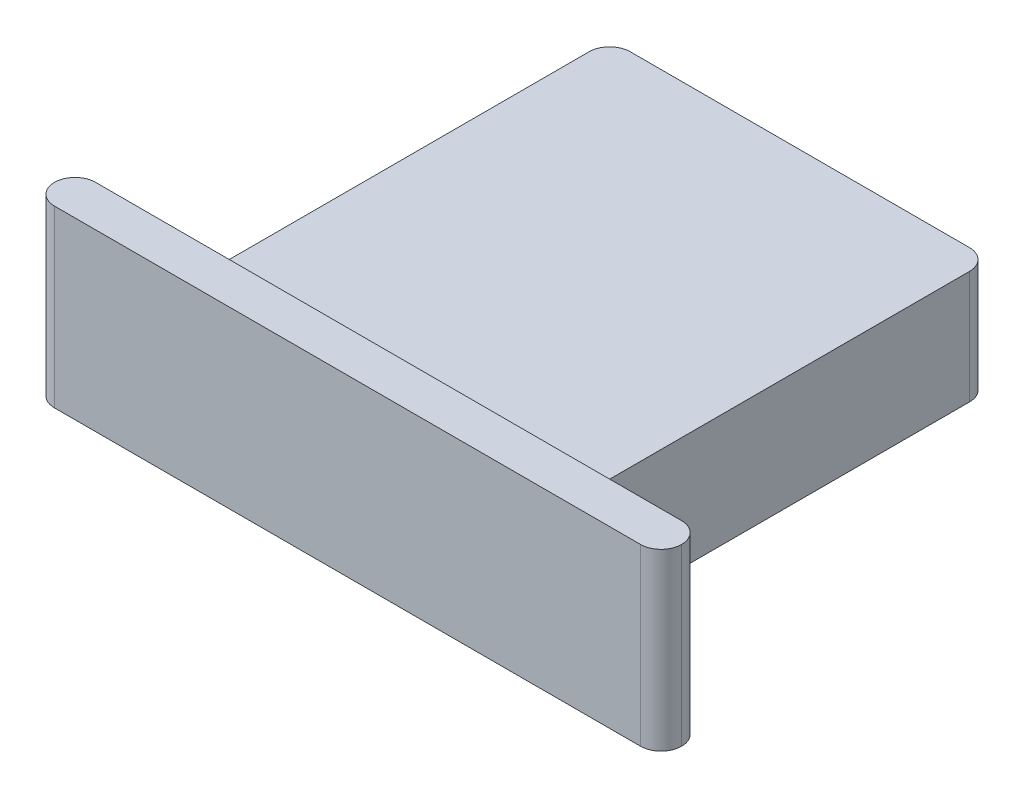
ISO-10303-21;
HEADER;
FILE_DESCRIPTION(('STEP AP214'),'2;1');
FILE_NAME('part.step','',(''),(''),'','','');
FILE_SCHEMA(('AUTOMOTIVE_DESIGN { 1 0 10303 214 1 1 1 1 }'));
ENDSEC;
DATA;
#1=APPLICATION_CONTEXT('core data for automotive mechanical design processes');
#2=APPLICATION_PROTOCOL_DEFINITION('international standard','automotive_design',2000,#1);
#3=PRODUCT_CONTEXT('',#1,'mechanical');
#4=PRODUCT('Part','Part','',(#3));
#5=PRODUCT_RELATED_PRODUCT_CATEGORY('part','',(#4));
#6=PRODUCT_DEFINITION_FORMATION('','',#4);
#7=PRODUCT_DEFINITION_CONTEXT('part definition',#1,'design');
#8=PRODUCT_DEFINITION('design','',#6,#7);
#9=PRODUCT_DEFINITION_SHAPE('','',#8);
#10=(LENGTH_UNIT() NAMED_UNIT(*) SI_UNIT(.MILLI.,.METRE.));
#11=(NAMED_UNIT(*) PLANE_ANGLE_UNIT() SI_UNIT($,.RADIAN.));
#12=(NAMED_UNIT(*) SI_UNIT($,.STERADIAN.) SOLID_ANGLE_UNIT());
#13=UNCERTAINTY_MEASURE_WITH_UNIT(LENGTH_MEASURE(1.E-05),#10,'distance_accuracy_value','');
#14=(GEOMETRIC_REPRESENTATION_CONTEXT(3) GLOBAL_UNCERTAINTY_ASSIGNED_CONTEXT((#13)) GLOBAL_UNIT_ASSIGNED_CONTEXT((#10,
#11,#12)) REPRESENTATION_CONTEXT('',''));
#15=CARTESIAN_POINT('',(0.,0.,0.));
#16=DIRECTION('',(0.,0.,1.));
#17=DIRECTION('',(1.,0.,0.));
#18=AXIS2_PLACEMENT_3D('',#15,#16,#17);
#19=CARTESIAN_POINT('',(9.25,-2.75,20.));
#20=DIRECTION('',(-1.,0.,0.));
#21=DIRECTION('',(0.,0.,1.));
#22=AXIS2_PLACEMENT_3D('',#19,#20,#21);
#23=PLANE('',#22);
#24=DIRECTION('',(0.,0.,-1.));
#25=VECTOR('',#24,1.);
#26=CARTESIAN_POINT('',(9.25,-2.75,20.));
#27=LINE('',#26,#25);
#28=CARTESIAN_POINT('',(9.25,-2.75,20.));
#29=VERTEX_POINT('',#28);
#30=CARTESIAN_POINT('',(9.25,-2.75,1.));
#31=VERTEX_POINT('',#30);
#32=EDGE_CURVE('E136',#29,#31,#27,.T.);
#33=ORIENTED_EDGE('',*,*,#32,.T.);
#34=DIRECTION('',(0.,1.,0.));
#35=VECTOR('',#34,1.);
#36=CARTESIAN_POINT('',(9.25,-2.75,1.));
#37=LINE('',#36,#35);
#38=CARTESIAN_POINT('',(9.25,2.75,1.));
#39=VERTEX_POINT('',#38);
#40=EDGE_CURVE('E209',#31,#39,#37,.T.);
#41=ORIENTED_EDGE('',*,*,#40,.T.);
#42=DIRECTION('',(0.,0.,-1.));
#43=VECTOR('',#42,1.);
#44=CARTESIAN_POINT('',(9.25,2.75,20.));
#45=LINE('',#44,#43);
#46=CARTESIAN_POINT('',(9.25,2.75,20.));
#47=VERTEX_POINT('',#46);
#48=EDGE_CURVE('E147',#47,#39,#45,.T.);
#49=ORIENTED_EDGE('',*,*,#48,.F.);
#50=DIRECTION('',(0.,1.,0.));
#51=VECTOR('',#50,1.);
#52=CARTESIAN_POINT('',(9.25,-2.75,20.));
#53=LINE('',#52,#51);
#54=EDGE_CURVE('E129',#29,#47,#53,.T.);
#55=ORIENTED_EDGE('',*,*,#54,.F.);
#56=EDGE_LOOP('',(#33,#41,#49,#55));
#57=FACE_BOUND('',#56,.T.);
#58=ADVANCED_FACE('F38',(#57),#23,.F.);
#59=CARTESIAN_POINT('',(9.25,2.75,20.));
#60=DIRECTION('',(0.,-1.,0.));
#61=DIRECTION('',(1.,0.,0.));
#62=AXIS2_PLACEMENT_3D('',#59,#60,#61);
#63=PLANE('',#62);
#64=ORIENTED_EDGE('',*,*,#48,.T.);
#65=CARTESIAN_POINT('',(8.25,2.75,1.));
#66=DIRECTION('',(0.,-1.,0.));
#67=DIRECTION('',(1.,0.,0.));
#68=AXIS2_PLACEMENT_3D('',#65,#66,#67);
#69=CIRCLE('',#68,1.);
#70=CARTESIAN_POINT('',(8.25,2.75,0.));
#71=VERTEX_POINT('',#70);
#72=EDGE_CURVE('E60',#39,#71,#69,.F.);
#73=ORIENTED_EDGE('',*,*,#72,.T.);
#74=DIRECTION('',(-1.,0.,0.));
#75=VECTOR('',#74,1.);
#76=CARTESIAN_POINT('',(9.25,2.75,0.));
#77=LINE('',#76,#75);
#78=CARTESIAN_POINT('',(-8.25,2.75,0.));
#79=VERTEX_POINT('',#78);
#80=EDGE_CURVE('E152',#71,#79,#77,.T.);
#81=ORIENTED_EDGE('',*,*,#80,.T.);
#82=CARTESIAN_POINT('',(-8.25,2.75,1.));
#83=DIRECTION('',(0.,-1.,0.));
#84=DIRECTION('',(1.,0.,0.));
#85=AXIS2_PLACEMENT_3D('',#82,#83,#84);
#86=CIRCLE('',#85,1.);
#87=CARTESIAN_POINT('',(-9.25,2.75,1.));
#88=VERTEX_POINT('',#87);
#89=EDGE_CURVE('E202',#79,#88,#86,.F.);
#90=ORIENTED_EDGE('',*,*,#89,.T.);
#91=DIRECTION('',(0.,0.,-1.));
#92=VECTOR('',#91,1.);
#93=CARTESIAN_POINT('',(-9.25,2.75,20.));
#94=LINE('',#93,#92);
#95=CARTESIAN_POINT('',(-9.25,2.75,20.));
#96=VERTEX_POINT('',#95);
#97=EDGE_CURVE('E162',#96,#88,#94,.T.);
#98=ORIENTED_EDGE('',*,*,#97,.F.);
#99=DIRECTION('',(-1.,0.,0.));
#100=VECTOR('',#99,1.);
#101=CARTESIAN_POINT('',(9.25,2.75,20.));
#102=LINE('',#101,#100);
#103=EDGE_CURVE('E148',#47,#96,#102,.T.);
#104=ORIENTED_EDGE('',*,*,#103,.F.);
#105=EDGE_LOOP('',(#64,#73,#81,#90,#98,#104));
#106=FACE_BOUND('',#105,.T.);
#107=ADVANCED_FACE('F212',(#106),#63,.F.);
#108=CARTESIAN_POINT('',(-9.25,-2.75,20.));
#109=DIRECTION('',(-1.,0.,0.));
#110=DIRECTION('',(0.,0.,1.));
#111=AXIS2_PLACEMENT_3D('',#108,#109,#110);
#112=PLANE('',#111);
#113=ORIENTED_EDGE('',*,*,#97,.T.);
#114=DIRECTION('',(0.,1.,0.));
#115=VECTOR('',#114,1.);
#116=CARTESIAN_POINT('',(-9.25,-2.75,1.));
#117=LINE('',#116,#115);
#118=CARTESIAN_POINT('',(-9.25,-2.75,1.));
#119=VERTEX_POINT('',#118);
#120=EDGE_CURVE('E204',#88,#119,#117,.F.);
#121=ORIENTED_EDGE('',*,*,#120,.T.);
#122=DIRECTION('',(0.,0.,-1.));
#123=VECTOR('',#122,1.);
#124=CARTESIAN_POINT('',(-9.25,-2.75,20.));
#125=LINE('',#124,#123);
#126=CARTESIAN_POINT('',(-9.25,-2.75,20.));
#127=VERTEX_POINT('',#126);
#128=EDGE_CURVE('E144',#127,#119,#125,.T.);
#129=ORIENTED_EDGE('',*,*,#128,.F.);
#130=DIRECTION('',(0.,1.,0.));
#131=VECTOR('',#130,1.);
#132=CARTESIAN_POINT('',(-9.25,-2.75,20.));
#133=LINE('',#132,#131);
#134=EDGE_CURVE('E132',#127,#96,#133,.T.);
#135=ORIENTED_EDGE('',*,*,#134,.T.);
#136=EDGE_LOOP('',(#113,#121,#129,#135));
#137=FACE_BOUND('',#136,.T.);
#138=ADVANCED_FACE('F217',(#137),#112,.T.);
#139=CARTESIAN_POINT('',(9.25,-2.75,20.));
#140=DIRECTION('',(0.,-1.,0.));
#141=DIRECTION('',(1.,0.,0.));
#142=AXIS2_PLACEMENT_3D('',#139,#140,#141);
#143=PLANE('',#142);
#144=CARTESIAN_POINT('',(0.,-2.75,11.5));
#145=DIRECTION('',(0.,-1.,0.));
#146=DIRECTION('',(1.,0.,0.));
#147=AXIS2_PLACEMENT_3D('',#144,#145,#146);
#148=CIRCLE('',#147,7.);
#149=CARTESIAN_POINT('',(7.,-2.75,11.5));
#150=VERTEX_POINT('',#149);
#151=EDGE_CURVE('E155',#150,#150,#148,.T.);
#152=ORIENTED_EDGE('',*,*,#151,.F.);
#153=EDGE_LOOP('',(#152));
#154=FACE_BOUND('',#153,.T.);
#155=DIRECTION('',(-1.,0.,0.));
#156=VECTOR('',#155,1.);
#157=CARTESIAN_POINT('',(9.25,-2.75,0.));
#158=LINE('',#157,#156);
#159=CARTESIAN_POINT('',(8.25,-2.75,0.));
#160=VERTEX_POINT('',#159);
#161=CARTESIAN_POINT('',(-8.25,-2.75,0.));
#162=VERTEX_POINT('',#161);
#163=EDGE_CURVE('E149',#160,#162,#158,.T.);
#164=ORIENTED_EDGE('',*,*,#163,.F.);
#165=CARTESIAN_POINT('',(8.25,-2.75,1.));
#166=DIRECTION('',(0.,-1.,0.));
#167=DIRECTION('',(1.,0.,0.));
#168=AXIS2_PLACEMENT_3D('',#165,#166,#167);
#169=CIRCLE('',#168,1.);
#170=EDGE_CURVE('E11',#160,#31,#169,.T.);
#171=ORIENTED_EDGE('',*,*,#170,.T.);
#172=ORIENTED_EDGE('',*,*,#32,.F.);
#173=DIRECTION('',(-1.,0.,0.));
#174=VECTOR('',#173,1.);
#175=CARTESIAN_POINT('',(9.25,-2.75,20.));
#176=LINE('',#175,#174);
#177=EDGE_CURVE('E124',#29,#127,#176,.T.);
#178=ORIENTED_EDGE('',*,*,#177,.T.);
#179=ORIENTED_EDGE('',*,*,#128,.T.);
#180=CARTESIAN_POINT('',(-8.25,-2.75,1.));
#181=DIRECTION('',(0.,-1.,0.));
#182=DIRECTION('',(1.,0.,0.));
#183=AXIS2_PLACEMENT_3D('',#180,#181,#182);
#184=CIRCLE('',#183,1.);
#185=EDGE_CURVE('E206',#119,#162,#184,.T.);
#186=ORIENTED_EDGE('',*,*,#185,.T.);
#187=EDGE_LOOP('',(#164,#171,#172,#178,#179,#186));
#188=FACE_BOUND('',#187,.T.);
#189=ADVANCED_FACE('F139',(#154,#188),#143,.T.);
#190=CARTESIAN_POINT('',(0.,0.,0.));
#191=DIRECTION('',(0.,0.,1.));
#192=DIRECTION('',(1.,0.,0.));
#193=AXIS2_PLACEMENT_3D('',#190,#191,#192);
#194=PLANE('',#193);
#195=CARTESIAN_POINT('',(0.,0.,0.));
#196=DIRECTION('',(0.,0.,-1.));
#197=DIRECTION('',(-1.,0.,0.));
#198=AXIS2_PLACEMENT_3D('',#195,#196,#197);
#199=CIRCLE('',#198,2.);
#200=CARTESIAN_POINT('',(-2.,0.,0.));
#201=VERTEX_POINT('',#200);
#202=EDGE_CURVE('E284',#201,#201,#199,.T.);
#203=ORIENTED_EDGE('',*,*,#202,.F.);
#204=EDGE_LOOP('',(#203));
#205=FACE_BOUND('',#204,.T.);
#206=ORIENTED_EDGE('',*,*,#80,.F.);
#207=DIRECTION('',(0.,1.,0.));
#208=VECTOR('',#207,1.);
#209=CARTESIAN_POINT('',(8.25,0.,0.));
#210=LINE('',#209,#208);
#211=EDGE_CURVE('E46',#71,#160,#210,.F.);
#212=ORIENTED_EDGE('',*,*,#211,.T.);
#213=ORIENTED_EDGE('',*,*,#163,.T.);
#214=DIRECTION('',(0.,1.,0.));
#215=VECTOR('',#214,1.);
#216=CARTESIAN_POINT('',(-8.25,2.75,0.));
#217=LINE('',#216,#215);
#218=EDGE_CURVE('E199',#162,#79,#217,.T.);
#219=ORIENTED_EDGE('',*,*,#218,.T.);
#220=EDGE_LOOP('',(#206,#212,#213,#219));
#221=FACE_BOUND('',#220,.T.);
#222=ADVANCED_FACE('F222',(#205,#221),#194,.F.);
#223=CARTESIAN_POINT('',(0.,-1.75,11.5));
#224=DIRECTION('',(0.,-1.,0.));
#225=DIRECTION('',(1.,0.,0.));
#226=AXIS2_PLACEMENT_3D('',#223,#224,#225);
#227=CYLINDRICAL_SURFACE('',#226,7.);
#228=CARTESIAN_POINT('',(0.,-1.75,11.5));
#229=DIRECTION('',(0.,-1.,0.));
#230=DIRECTION('',(1.,0.,0.));
#231=AXIS2_PLACEMENT_3D('',#228,#229,#230);
#232=CIRCLE('',#231,7.);
#233=CARTESIAN_POINT('',(7.,-1.75,11.5));
#234=VERTEX_POINT('',#233);
#235=EDGE_CURVE('E159',#234,#234,#232,.T.);
#236=ORIENTED_EDGE('',*,*,#235,.F.);
#237=EDGE_LOOP('',(#236));
#238=FACE_BOUND('',#237,.T.);
#239=ORIENTED_EDGE('',*,*,#151,.T.);
#240=EDGE_LOOP('',(#239));
#241=FACE_BOUND('',#240,.T.);
#242=ADVANCED_FACE('F295',(#238,#241),#227,.F.);
#243=CARTESIAN_POINT('',(0.,-1.75,11.5));
#244=DIRECTION('',(0.,-1.,0.));
#245=DIRECTION('',(1.,0.,0.));
#246=AXIS2_PLACEMENT_3D('',#243,#244,#245);
#247=PLANE('',#246);
#248=ORIENTED_EDGE('',*,*,#235,.T.);
#249=EDGE_LOOP('',(#248));
#250=FACE_BOUND('',#249,.T.);
#251=ADVANCED_FACE('F308',(#250),#247,.T.);
#252=CARTESIAN_POINT('',(-15.25,-4.25,22.));
#253=DIRECTION('',(0.,1.,0.));
#254=DIRECTION('',(0.,0.,1.));
#255=AXIS2_PLACEMENT_3D('',#252,#253,#254);
#256=PLANE('',#255);
#257=DIRECTION('',(1.,0.,0.));
#258=VECTOR('',#257,1.);
#259=CARTESIAN_POINT('',(-15.25,-4.25,20.));
#260=LINE('',#259,#258);
#261=CARTESIAN_POINT('',(-14.25,-4.25,20.));
#262=VERTEX_POINT('',#261);
#263=CARTESIAN_POINT('',(14.25,-4.25,20.));
#264=VERTEX_POINT('',#263);
#265=EDGE_CURVE('E267',#262,#264,#260,.T.);
#266=ORIENTED_EDGE('',*,*,#265,.T.);
#267=CARTESIAN_POINT('',(14.25,-4.25,21.));
#268=DIRECTION('',(0.,1.,0.));
#269=DIRECTION('',(0.,0.,1.));
#270=AXIS2_PLACEMENT_3D('',#267,#268,#269);
#271=CIRCLE('',#270,1.);
#272=CARTESIAN_POINT('',(15.25,-4.25,21.));
#273=VERTEX_POINT('',#272);
#274=EDGE_CURVE('E197',#264,#273,#271,.F.);
#275=ORIENTED_EDGE('',*,*,#274,.T.);
#276=CARTESIAN_POINT('',(14.25,-4.25,21.));
#277=DIRECTION('',(0.,1.,0.));
#278=DIRECTION('',(0.,0.,1.));
#279=AXIS2_PLACEMENT_3D('',#276,#277,#278);
#280=CIRCLE('',#279,1.);
#281=CARTESIAN_POINT('',(14.25,-4.25,22.));
#282=VERTEX_POINT('',#281);
#283=EDGE_CURVE('E191',#273,#282,#280,.F.);
#284=ORIENTED_EDGE('',*,*,#283,.T.);
#285=DIRECTION('',(1.,0.,0.));
#286=VECTOR('',#285,1.);
#287=CARTESIAN_POINT('',(-15.25,-4.25,22.));
#288=LINE('',#287,#286);
#289=CARTESIAN_POINT('',(-14.25,-4.25,22.));
#290=VERTEX_POINT('',#289);
#291=EDGE_CURVE('E275',#290,#282,#288,.T.);
#292=ORIENTED_EDGE('',*,*,#291,.F.);
#293=CARTESIAN_POINT('',(-14.25,-4.25,21.));
#294=DIRECTION('',(0.,1.,0.));
#295=DIRECTION('',(0.,0.,1.));
#296=AXIS2_PLACEMENT_3D('',#293,#294,#295);
#297=CIRCLE('',#296,1.);
#298=CARTESIAN_POINT('',(-15.25,-4.25,21.));
#299=VERTEX_POINT('',#298);
#300=EDGE_CURVE('E173',#290,#299,#297,.F.);
#301=ORIENTED_EDGE('',*,*,#300,.T.);
#302=CARTESIAN_POINT('',(-14.25,-4.25,21.));
#303=DIRECTION('',(0.,1.,0.));
#304=DIRECTION('',(0.,0.,1.));
#305=AXIS2_PLACEMENT_3D('',#302,#303,#304);
#306=CIRCLE('',#305,1.);
#307=EDGE_CURVE('E180',#299,#262,#306,.F.);
#308=ORIENTED_EDGE('',*,*,#307,.T.);
#309=EDGE_LOOP('',(#266,#275,#284,#292,#301,#308));
#310=FACE_BOUND('',#309,.T.);
#311=ADVANCED_FACE('F263',(#310),#256,.F.);
#312=CARTESIAN_POINT('',(-15.25,4.25,22.));
#313=DIRECTION('',(0.,1.,0.));
#314=DIRECTION('',(0.,0.,1.));
#315=AXIS2_PLACEMENT_3D('',#312,#313,#314);
#316=PLANE('',#315);
#317=CARTESIAN_POINT('',(14.25,4.25,21.));
#318=DIRECTION('',(0.,1.,0.));
#319=DIRECTION('',(0.,0.,1.));
#320=AXIS2_PLACEMENT_3D('',#317,#318,#319);
#321=CIRCLE('',#320,1.);
#322=CARTESIAN_POINT('',(14.25,4.25,22.));
#323=VERTEX_POINT('',#322);
#324=CARTESIAN_POINT('',(15.25,4.25,21.));
#325=VERTEX_POINT('',#324);
#326=EDGE_CURVE('E185',#323,#325,#321,.T.);
#327=ORIENTED_EDGE('',*,*,#326,.T.);
#328=CARTESIAN_POINT('',(14.25,4.25,21.));
#329=DIRECTION('',(0.,1.,0.));
#330=DIRECTION('',(0.,0.,1.));
#331=AXIS2_PLACEMENT_3D('',#328,#329,#330);
#332=CIRCLE('',#331,1.);
#333=CARTESIAN_POINT('',(14.25,4.25,20.));
#334=VERTEX_POINT('',#333);
#335=EDGE_CURVE('E193',#325,#334,#332,.T.);
#336=ORIENTED_EDGE('',*,*,#335,.T.);
#337=DIRECTION('',(1.,0.,0.));
#338=VECTOR('',#337,1.);
#339=CARTESIAN_POINT('',(-15.25,4.25,20.));
#340=LINE('',#339,#338);
#341=CARTESIAN_POINT('',(-14.25,4.25,20.));
#342=VERTEX_POINT('',#341);
#343=EDGE_CURVE('E281',#342,#334,#340,.T.);
#344=ORIENTED_EDGE('',*,*,#343,.F.);
#345=CARTESIAN_POINT('',(-14.25,4.25,21.));
#346=DIRECTION('',(0.,1.,0.));
#347=DIRECTION('',(0.,0.,1.));
#348=AXIS2_PLACEMENT_3D('',#345,#346,#347);
#349=CIRCLE('',#348,1.);
#350=CARTESIAN_POINT('',(-15.25,4.25,21.));
#351=VERTEX_POINT('',#350);
#352=EDGE_CURVE('E178',#342,#351,#349,.T.);
#353=ORIENTED_EDGE('',*,*,#352,.T.);
#354=CARTESIAN_POINT('',(-14.25,4.25,21.));
#355=DIRECTION('',(0.,1.,0.));
#356=DIRECTION('',(0.,0.,1.));
#357=AXIS2_PLACEMENT_3D('',#354,#355,#356);
#358=CIRCLE('',#357,1.);
#359=CARTESIAN_POINT('',(-14.25,4.25,22.));
#360=VERTEX_POINT('',#359);
#361=EDGE_CURVE('E169',#351,#360,#358,.T.);
#362=ORIENTED_EDGE('',*,*,#361,.T.);
#363=DIRECTION('',(1.,0.,0.));
#364=VECTOR('',#363,1.);
#365=CARTESIAN_POINT('',(-15.25,4.25,22.));
#366=LINE('',#365,#364);
#367=EDGE_CURVE('E273',#360,#323,#366,.T.);
#368=ORIENTED_EDGE('',*,*,#367,.T.);
#369=EDGE_LOOP('',(#327,#336,#344,#353,#362,#368));
#370=FACE_BOUND('',#369,.T.);
#371=ADVANCED_FACE('F277',(#370),#316,.T.);
#372=CARTESIAN_POINT('',(0.,0.,22.));
#373=DIRECTION('',(0.,0.,-1.));
#374=DIRECTION('',(-1.,0.,0.));
#375=AXIS2_PLACEMENT_3D('',#372,#373,#374);
#376=PLANE('',#375);
#377=ORIENTED_EDGE('',*,*,#291,.T.);
#378=DIRECTION('',(0.,1.,0.));
#379=VECTOR('',#378,1.);
#380=CARTESIAN_POINT('',(14.25,0.,22.));
#381=LINE('',#380,#379);
#382=EDGE_CURVE('E182',#282,#323,#381,.T.);
#383=ORIENTED_EDGE('',*,*,#382,.T.);
#384=ORIENTED_EDGE('',*,*,#367,.F.);
#385=DIRECTION('',(0.,1.,0.));
#386=VECTOR('',#385,1.);
#387=CARTESIAN_POINT('',(-14.25,-4.25,22.));
#388=LINE('',#387,#386);
#389=EDGE_CURVE('E171',#360,#290,#388,.F.);
#390=ORIENTED_EDGE('',*,*,#389,.T.);
#391=EDGE_LOOP('',(#377,#383,#384,#390));
#392=FACE_BOUND('',#391,.T.);
#393=ADVANCED_FACE('F272',(#392),#376,.F.);
#394=CARTESIAN_POINT('',(0.,0.,20.));
#395=DIRECTION('',(0.,0.,-1.));
#396=DIRECTION('',(-1.,0.,0.));
#397=AXIS2_PLACEMENT_3D('',#394,#395,#396);
#398=PLANE('',#397);
#399=ORIENTED_EDGE('',*,*,#177,.F.);
#400=ORIENTED_EDGE('',*,*,#54,.T.);
#401=ORIENTED_EDGE('',*,*,#103,.T.);
#402=ORIENTED_EDGE('',*,*,#134,.F.);
#403=EDGE_LOOP('',(#399,#400,#401,#402));
#404=FACE_BOUND('',#403,.T.);
#405=ORIENTED_EDGE('',*,*,#343,.T.);
#406=DIRECTION('',(0.,1.,0.));
#407=VECTOR('',#406,1.);
#408=CARTESIAN_POINT('',(14.25,-4.25,20.));
#409=LINE('',#408,#407);
#410=EDGE_CURVE('E195',#334,#264,#409,.F.);
#411=ORIENTED_EDGE('',*,*,#410,.T.);
#412=ORIENTED_EDGE('',*,*,#265,.F.);
#413=DIRECTION('',(0.,1.,0.));
#414=VECTOR('',#413,1.);
#415=CARTESIAN_POINT('',(-14.25,0.,20.));
#416=LINE('',#415,#414);
#417=EDGE_CURVE('E175',#262,#342,#416,.T.);
#418=ORIENTED_EDGE('',*,*,#417,.T.);
#419=EDGE_LOOP('',(#405,#411,#412,#418));
#420=FACE_BOUND('',#419,.T.);
#421=ADVANCED_FACE('F126',(#404,#420),#398,.T.);
#422=CARTESIAN_POINT('',(-14.25,-4.25,21.));
#423=DIRECTION('',(0.,-1.,0.));
#424=DIRECTION('',(0.,0.,-1.));
#425=AXIS2_PLACEMENT_3D('',#422,#423,#424);
#426=CYLINDRICAL_SURFACE('',#425,1.);
#427=ORIENTED_EDGE('',*,*,#300,.F.);
#428=ORIENTED_EDGE('',*,*,#389,.F.);
#429=ORIENTED_EDGE('',*,*,#361,.F.);
#430=DIRECTION('',(0.,1.,0.));
#431=VECTOR('',#430,1.);
#432=CARTESIAN_POINT('',(-15.25,4.25,21.));
#433=LINE('',#432,#431);
#434=EDGE_CURVE('E166',#299,#351,#433,.T.);
#435=ORIENTED_EDGE('',*,*,#434,.F.);
#436=EDGE_LOOP('',(#427,#428,#429,#435));
#437=FACE_BOUND('',#436,.T.);
#438=ADVANCED_FACE('F236',(#437),#426,.T.);
#439=CARTESIAN_POINT('',(-14.25,0.,21.));
#440=DIRECTION('',(0.,1.,0.));
#441=DIRECTION('',(0.,0.,1.));
#442=AXIS2_PLACEMENT_3D('',#439,#440,#441);
#443=CYLINDRICAL_SURFACE('',#442,1.);
#444=ORIENTED_EDGE('',*,*,#307,.F.);
#445=ORIENTED_EDGE('',*,*,#434,.T.);
#446=ORIENTED_EDGE('',*,*,#352,.F.);
#447=ORIENTED_EDGE('',*,*,#417,.F.);
#448=EDGE_LOOP('',(#444,#445,#446,#447));
#449=FACE_BOUND('',#448,.T.);
#450=ADVANCED_FACE('F239',(#449),#443,.T.);
#451=CARTESIAN_POINT('',(14.25,0.,21.));
#452=DIRECTION('',(0.,1.,0.));
#453=DIRECTION('',(0.,0.,1.));
#454=AXIS2_PLACEMENT_3D('',#451,#452,#453);
#455=CYLINDRICAL_SURFACE('',#454,1.);
#456=ORIENTED_EDGE('',*,*,#283,.F.);
#457=DIRECTION('',(0.,1.,0.));
#458=VECTOR('',#457,1.);
#459=CARTESIAN_POINT('',(15.25,-4.25,21.));
#460=LINE('',#459,#458);
#461=EDGE_CURVE('E188',#325,#273,#460,.F.);
#462=ORIENTED_EDGE('',*,*,#461,.F.);
#463=ORIENTED_EDGE('',*,*,#326,.F.);
#464=ORIENTED_EDGE('',*,*,#382,.F.);
#465=EDGE_LOOP('',(#456,#462,#463,#464));
#466=FACE_BOUND('',#465,.T.);
#467=ADVANCED_FACE('F243',(#466),#455,.T.);
#468=CARTESIAN_POINT('',(14.25,-4.25,21.));
#469=DIRECTION('',(0.,-1.,0.));
#470=DIRECTION('',(0.,0.,-1.));
#471=AXIS2_PLACEMENT_3D('',#468,#469,#470);
#472=CYLINDRICAL_SURFACE('',#471,1.);
#473=ORIENTED_EDGE('',*,*,#274,.F.);
#474=ORIENTED_EDGE('',*,*,#410,.F.);
#475=ORIENTED_EDGE('',*,*,#335,.F.);
#476=ORIENTED_EDGE('',*,*,#461,.T.);
#477=EDGE_LOOP('',(#473,#474,#475,#476));
#478=FACE_BOUND('',#477,.T.);
#479=ADVANCED_FACE('F247',(#478),#472,.T.);
#480=CARTESIAN_POINT('',(0.,0.,4.));
#481=DIRECTION('',(0.,0.,-1.));
#482=DIRECTION('',(-1.,0.,0.));
#483=AXIS2_PLACEMENT_3D('',#480,#481,#482);
#484=CYLINDRICAL_SURFACE('',#483,2.);
#485=CARTESIAN_POINT('',(0.,0.,4.));
#486=DIRECTION('',(0.,0.,-1.));
#487=DIRECTION('',(-1.,0.,0.));
#488=AXIS2_PLACEMENT_3D('',#485,#486,#487);
#489=CIRCLE('',#488,2.);
#490=CARTESIAN_POINT('',(-2.,0.,4.));
#491=VERTEX_POINT('',#490);
#492=EDGE_CURVE('E288',#491,#491,#489,.T.);
#493=ORIENTED_EDGE('',*,*,#492,.F.);
#494=EDGE_LOOP('',(#493));
#495=FACE_BOUND('',#494,.T.);
#496=ORIENTED_EDGE('',*,*,#202,.T.);
#497=EDGE_LOOP('',(#496));
#498=FACE_BOUND('',#497,.T.);
#499=ADVANCED_FACE('F250',(#495,#498),#484,.F.);
#500=CARTESIAN_POINT('',(0.,0.,4.));
#501=DIRECTION('',(0.,0.,-1.));
#502=DIRECTION('',(-1.,0.,0.));
#503=AXIS2_PLACEMENT_3D('',#500,#501,#502);
#504=PLANE('',#503);
#505=ORIENTED_EDGE('',*,*,#492,.T.);
#506=EDGE_LOOP('',(#505));
#507=FACE_BOUND('',#506,.T.);
#508=ADVANCED_FACE('F227',(#507),#504,.T.);
#509=CARTESIAN_POINT('',(-8.25,0.,1.));
#510=DIRECTION('',(0.,-1.,0.));
#511=DIRECTION('',(0.,0.,-1.));
#512=AXIS2_PLACEMENT_3D('',#509,#510,#511);
#513=CYLINDRICAL_SURFACE('',#512,1.);
#514=ORIENTED_EDGE('',*,*,#185,.F.);
#515=ORIENTED_EDGE('',*,*,#120,.F.);
#516=ORIENTED_EDGE('',*,*,#89,.F.);
#517=ORIENTED_EDGE('',*,*,#218,.F.);
#518=EDGE_LOOP('',(#514,#515,#516,#517));
#519=FACE_BOUND('',#518,.T.);
#520=ADVANCED_FACE('F221',(#519),#513,.T.);
#521=CARTESIAN_POINT('',(8.25,-2.75,1.));
#522=DIRECTION('',(0.,1.,0.));
#523=DIRECTION('',(0.,0.,1.));
#524=AXIS2_PLACEMENT_3D('',#521,#522,#523);
#525=CYLINDRICAL_SURFACE('',#524,1.);
#526=ORIENTED_EDGE('',*,*,#170,.F.);
#527=ORIENTED_EDGE('',*,*,#211,.F.);
#528=ORIENTED_EDGE('',*,*,#72,.F.);
#529=ORIENTED_EDGE('',*,*,#40,.F.);
#530=EDGE_LOOP('',(#526,#527,#528,#529));
#531=FACE_BOUND('',#530,.T.);
#532=ADVANCED_FACE('F40',(#531),#525,.T.);
#533=CLOSED_SHELL('',(#58,#107,#138,#189,#222,#242,#251,#311,#371,#393,#421,#438,#450,#467,#479,
#499,#508,#520,#532));
#534=MANIFOLD_SOLID_BREP('B2',#533);
#535=ADVANCED_BREP_SHAPE_REPRESENTATION('',(#18,#534),#14);
#536=SHAPE_DEFINITION_REPRESENTATION(#9,#535);
ENDSEC;
END-ISO-10303-21;
